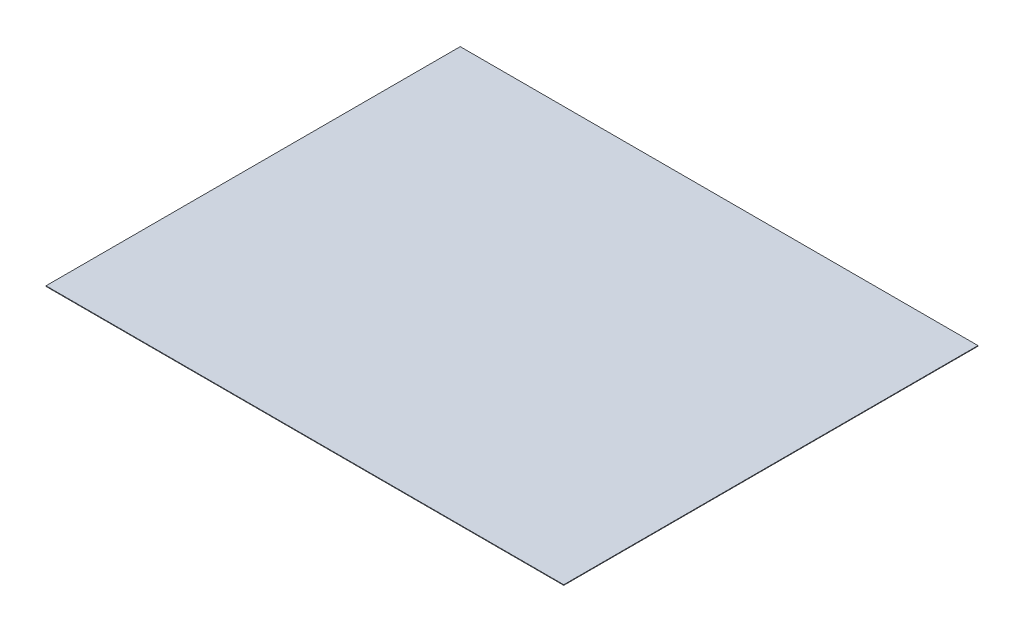
ISO-10303-21;
HEADER;
FILE_DESCRIPTION(('STEP AP214'),'2;1');
FILE_NAME('part.step','',(''),(''),'','','');
FILE_SCHEMA(('AUTOMOTIVE_DESIGN { 1 0 10303 214 1 1 1 1 }'));
ENDSEC;
DATA;
#1=APPLICATION_CONTEXT('core data for automotive mechanical design processes');
#2=APPLICATION_PROTOCOL_DEFINITION('international standard','automotive_design',2000,#1);
#3=PRODUCT_CONTEXT('',#1,'mechanical');
#4=PRODUCT('Part','Part','',(#3));
#5=PRODUCT_RELATED_PRODUCT_CATEGORY('part','',(#4));
#6=PRODUCT_DEFINITION_FORMATION('','',#4);
#7=PRODUCT_DEFINITION_CONTEXT('part definition',#1,'design');
#8=PRODUCT_DEFINITION('design','',#6,#7);
#9=PRODUCT_DEFINITION_SHAPE('','',#8);
#10=(LENGTH_UNIT() NAMED_UNIT(*) SI_UNIT(.MILLI.,.METRE.));
#11=(NAMED_UNIT(*) PLANE_ANGLE_UNIT() SI_UNIT($,.RADIAN.));
#12=(NAMED_UNIT(*) SI_UNIT($,.STERADIAN.) SOLID_ANGLE_UNIT());
#13=UNCERTAINTY_MEASURE_WITH_UNIT(LENGTH_MEASURE(1.E-05),#10,'distance_accuracy_value','');
#14=(GEOMETRIC_REPRESENTATION_CONTEXT(3) GLOBAL_UNCERTAINTY_ASSIGNED_CONTEXT((#13)) GLOBAL_UNIT_ASSIGNED_CONTEXT((#10,
#11,#12)) REPRESENTATION_CONTEXT('',''));
#15=CARTESIAN_POINT('',(0.,0.,0.));
#16=DIRECTION('',(0.,0.,1.));
#17=DIRECTION('',(1.,0.,0.));
#18=AXIS2_PLACEMENT_3D('',#15,#16,#17);
#19=CARTESIAN_POINT('',(4572.,10.,3657.6));
#20=DIRECTION('',(-1.,0.,0.));
#21=DIRECTION('',(0.,0.,1.));
#22=AXIS2_PLACEMENT_3D('',#19,#20,#21);
#23=PLANE('',#22);
#24=DIRECTION('',(0.,0.,-1.));
#25=VECTOR('',#24,1.);
#26=CARTESIAN_POINT('',(4572.,0.,3657.6));
#27=LINE('',#26,#25);
#28=CARTESIAN_POINT('',(4572.,0.,3657.6));
#29=VERTEX_POINT('',#28);
#30=CARTESIAN_POINT('',(4572.,0.,-3657.6));
#31=VERTEX_POINT('',#30);
#32=EDGE_CURVE('E95',#29,#31,#27,.T.);
#33=ORIENTED_EDGE('',*,*,#32,.T.);
#34=DIRECTION('',(0.,-1.,0.));
#35=VECTOR('',#34,1.);
#36=CARTESIAN_POINT('',(4572.,10.,-3657.6));
#37=LINE('',#36,#35);
#38=CARTESIAN_POINT('',(4572.,10.,-3657.6));
#39=VERTEX_POINT('',#38);
#40=EDGE_CURVE('E11',#39,#31,#37,.T.);
#41=ORIENTED_EDGE('',*,*,#40,.F.);
#42=DIRECTION('',(0.,0.,-1.));
#43=VECTOR('',#42,1.);
#44=CARTESIAN_POINT('',(4572.,10.,3657.6));
#45=LINE('',#44,#43);
#46=CARTESIAN_POINT('',(4572.,10.,3657.6));
#47=VERTEX_POINT('',#46);
#48=EDGE_CURVE('E83',#47,#39,#45,.T.);
#49=ORIENTED_EDGE('',*,*,#48,.F.);
#50=DIRECTION('',(0.,-1.,0.));
#51=VECTOR('',#50,1.);
#52=CARTESIAN_POINT('',(4572.,10.,3657.6));
#53=LINE('',#52,#51);
#54=EDGE_CURVE('E91',#47,#29,#53,.T.);
#55=ORIENTED_EDGE('',*,*,#54,.T.);
#56=EDGE_LOOP('',(#33,#41,#49,#55));
#57=FACE_BOUND('',#56,.T.);
#58=ADVANCED_FACE('F32',(#57),#23,.F.);
#59=CARTESIAN_POINT('',(-4572.,10.,-3657.6));
#60=DIRECTION('',(0.,0.,1.));
#61=DIRECTION('',(1.,0.,0.));
#62=AXIS2_PLACEMENT_3D('',#59,#60,#61);
#63=PLANE('',#62);
#64=DIRECTION('',(-1.,0.,0.));
#65=VECTOR('',#64,1.);
#66=CARTESIAN_POINT('',(-4572.,0.,-3657.6));
#67=LINE('',#66,#65);
#68=CARTESIAN_POINT('',(-4572.,0.,-3657.6));
#69=VERTEX_POINT('',#68);
#70=EDGE_CURVE('E87',#31,#69,#67,.T.);
#71=ORIENTED_EDGE('',*,*,#70,.T.);
#72=DIRECTION('',(0.,-1.,0.));
#73=VECTOR('',#72,1.);
#74=CARTESIAN_POINT('',(-4572.,10.,-3657.6));
#75=LINE('',#74,#73);
#76=CARTESIAN_POINT('',(-4572.,10.,-3657.6));
#77=VERTEX_POINT('',#76);
#78=EDGE_CURVE('E40',#77,#69,#75,.T.);
#79=ORIENTED_EDGE('',*,*,#78,.F.);
#80=DIRECTION('',(-1.,0.,0.));
#81=VECTOR('',#80,1.);
#82=CARTESIAN_POINT('',(-4572.,10.,-3657.6));
#83=LINE('',#82,#81);
#84=EDGE_CURVE('E78',#39,#77,#83,.T.);
#85=ORIENTED_EDGE('',*,*,#84,.F.);
#86=ORIENTED_EDGE('',*,*,#40,.T.);
#87=EDGE_LOOP('',(#71,#79,#85,#86));
#88=FACE_BOUND('',#87,.T.);
#89=ADVANCED_FACE('F86',(#88),#63,.F.);
#90=CARTESIAN_POINT('',(-4572.,10.,3657.6));
#91=DIRECTION('',(1.,0.,0.));
#92=DIRECTION('',(0.,0.,-1.));
#93=AXIS2_PLACEMENT_3D('',#90,#91,#92);
#94=PLANE('',#93);
#95=DIRECTION('',(0.,0.,1.));
#96=VECTOR('',#95,1.);
#97=CARTESIAN_POINT('',(-4572.,0.,3657.6));
#98=LINE('',#97,#96);
#99=CARTESIAN_POINT('',(-4572.,0.,3657.6));
#100=VERTEX_POINT('',#99);
#101=EDGE_CURVE('E65',#69,#100,#98,.T.);
#102=ORIENTED_EDGE('',*,*,#101,.T.);
#103=DIRECTION('',(0.,-1.,0.));
#104=VECTOR('',#103,1.);
#105=CARTESIAN_POINT('',(-4572.,10.,3657.6));
#106=LINE('',#105,#104);
#107=CARTESIAN_POINT('',(-4572.,10.,3657.6));
#108=VERTEX_POINT('',#107);
#109=EDGE_CURVE('E88',#108,#100,#106,.T.);
#110=ORIENTED_EDGE('',*,*,#109,.F.);
#111=DIRECTION('',(0.,0.,1.));
#112=VECTOR('',#111,1.);
#113=CARTESIAN_POINT('',(-4572.,10.,3657.6));
#114=LINE('',#113,#112);
#115=EDGE_CURVE('E81',#77,#108,#114,.T.);
#116=ORIENTED_EDGE('',*,*,#115,.F.);
#117=ORIENTED_EDGE('',*,*,#78,.T.);
#118=EDGE_LOOP('',(#102,#110,#116,#117));
#119=FACE_BOUND('',#118,.T.);
#120=ADVANCED_FACE('F89',(#119),#94,.F.);
#121=CARTESIAN_POINT('',(-4572.,10.,3657.6));
#122=DIRECTION('',(0.,0.,-1.));
#123=DIRECTION('',(-1.,0.,0.));
#124=AXIS2_PLACEMENT_3D('',#121,#122,#123);
#125=PLANE('',#124);
#126=DIRECTION('',(1.,0.,0.));
#127=VECTOR('',#126,1.);
#128=CARTESIAN_POINT('',(-4572.,0.,3657.6));
#129=LINE('',#128,#127);
#130=EDGE_CURVE('E71',#100,#29,#129,.T.);
#131=ORIENTED_EDGE('',*,*,#130,.T.);
#132=ORIENTED_EDGE('',*,*,#54,.F.);
#133=DIRECTION('',(1.,0.,0.));
#134=VECTOR('',#133,1.);
#135=CARTESIAN_POINT('',(-4572.,10.,3657.6));
#136=LINE('',#135,#134);
#137=EDGE_CURVE('E48',#108,#47,#136,.T.);
#138=ORIENTED_EDGE('',*,*,#137,.F.);
#139=ORIENTED_EDGE('',*,*,#109,.T.);
#140=EDGE_LOOP('',(#131,#132,#138,#139));
#141=FACE_BOUND('',#140,.T.);
#142=ADVANCED_FACE('F102',(#141),#125,.F.);
#143=CARTESIAN_POINT('',(0.,10.,0.));
#144=DIRECTION('',(0.,-1.,0.));
#145=DIRECTION('',(0.,0.,-1.));
#146=AXIS2_PLACEMENT_3D('',#143,#144,#145);
#147=PLANE('',#146);
#148=ORIENTED_EDGE('',*,*,#48,.T.);
#149=ORIENTED_EDGE('',*,*,#84,.T.);
#150=ORIENTED_EDGE('',*,*,#115,.T.);
#151=ORIENTED_EDGE('',*,*,#137,.T.);
#152=EDGE_LOOP('',(#148,#149,#150,#151));
#153=FACE_BOUND('',#152,.T.);
#154=ADVANCED_FACE('F79',(#153),#147,.F.);
#155=CARTESIAN_POINT('',(0.,0.,0.));
#156=DIRECTION('',(0.,-1.,0.));
#157=DIRECTION('',(0.,0.,-1.));
#158=AXIS2_PLACEMENT_3D('',#155,#156,#157);
#159=PLANE('',#158);
#160=ORIENTED_EDGE('',*,*,#32,.F.);
#161=ORIENTED_EDGE('',*,*,#130,.F.);
#162=ORIENTED_EDGE('',*,*,#101,.F.);
#163=ORIENTED_EDGE('',*,*,#70,.F.);
#164=EDGE_LOOP('',(#160,#161,#162,#163));
#165=FACE_BOUND('',#164,.T.);
#166=ADVANCED_FACE('F105',(#165),#159,.T.);
#167=CLOSED_SHELL('',(#58,#89,#120,#142,#154,#166));
#168=MANIFOLD_SOLID_BREP('B2',#167);
#169=ADVANCED_BREP_SHAPE_REPRESENTATION('',(#18,#168),#14);
#170=SHAPE_DEFINITION_REPRESENTATION(#9,#169);
ENDSEC;
END-ISO-10303-21;
